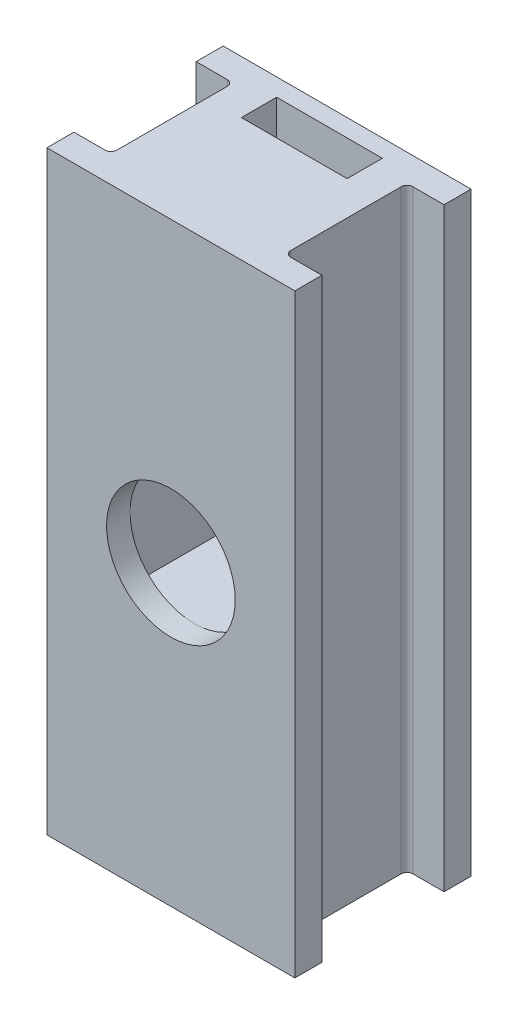
ISO-10303-21;
HEADER;
FILE_DESCRIPTION(('STEP AP214'),'2;1');
FILE_NAME('part.step','',(''),(''),'','','');
FILE_SCHEMA(('AUTOMOTIVE_DESIGN { 1 0 10303 214 1 1 1 1 }'));
ENDSEC;
DATA;
#1=APPLICATION_CONTEXT('core data for automotive mechanical design processes');
#2=APPLICATION_PROTOCOL_DEFINITION('international standard','automotive_design',2000,#1);
#3=PRODUCT_CONTEXT('',#1,'mechanical');
#4=PRODUCT('Part','Part','',(#3));
#5=PRODUCT_RELATED_PRODUCT_CATEGORY('part','',(#4));
#6=PRODUCT_DEFINITION_FORMATION('','',#4);
#7=PRODUCT_DEFINITION_CONTEXT('part definition',#1,'design');
#8=PRODUCT_DEFINITION('design','',#6,#7);
#9=PRODUCT_DEFINITION_SHAPE('','',#8);
#10=(LENGTH_UNIT() NAMED_UNIT(*) SI_UNIT(.MILLI.,.METRE.));
#11=(NAMED_UNIT(*) PLANE_ANGLE_UNIT() SI_UNIT($,.RADIAN.));
#12=(NAMED_UNIT(*) SI_UNIT($,.STERADIAN.) SOLID_ANGLE_UNIT());
#13=UNCERTAINTY_MEASURE_WITH_UNIT(LENGTH_MEASURE(1.E-05),#10,'distance_accuracy_value','');
#14=(GEOMETRIC_REPRESENTATION_CONTEXT(3) GLOBAL_UNCERTAINTY_ASSIGNED_CONTEXT((#13)) GLOBAL_UNIT_ASSIGNED_CONTEXT((#10,
#11,#12)) REPRESENTATION_CONTEXT('',''));
#15=CARTESIAN_POINT('',(0.,0.,0.));
#16=DIRECTION('',(0.,0.,1.));
#17=DIRECTION('',(1.,0.,0.));
#18=AXIS2_PLACEMENT_3D('',#15,#16,#17);
#19=CARTESIAN_POINT('',(10.5500000000305,-18.524999999939,7.5));
#20=DIRECTION('',(0.,1.,0.));
#21=DIRECTION('',(0.,0.,1.));
#22=AXIS2_PLACEMENT_3D('',#19,#20,#21);
#23=PLANE('',#22);
#24=DIRECTION('',(1.,0.,0.));
#25=VECTOR('',#24,1.);
#26=CARTESIAN_POINT('',(10.5500000000305,-18.524999999939,-7.5));
#27=LINE('',#26,#25);
#28=CARTESIAN_POINT('',(-10.5499999999696,-18.524999999939,-7.5));
#29=VERTEX_POINT('',#28);
#30=CARTESIAN_POINT('',(-5.55000000000001,-18.524999999939,-7.5));
#31=VERTEX_POINT('',#30);
#32=EDGE_CURVE('E386',#29,#31,#27,.T.);
#33=ORIENTED_EDGE('',*,*,#32,.T.);
#34=DIRECTION('',(0.,0.,1.));
#35=VECTOR('',#34,1.);
#36=CARTESIAN_POINT('',(-5.55000000000001,-18.524999999939,7.5));
#37=LINE('',#36,#35);
#38=CARTESIAN_POINT('',(-5.55000000000001,-18.524999999939,5.5));
#39=VERTEX_POINT('',#38);
#40=EDGE_CURVE('E308',#31,#39,#37,.T.);
#41=ORIENTED_EDGE('',*,*,#40,.T.);
#42=DIRECTION('',(1.,0.,0.));
#43=VECTOR('',#42,1.);
#44=CARTESIAN_POINT('',(10.5500000000305,-18.524999999939,5.5));
#45=LINE('',#44,#43);
#46=CARTESIAN_POINT('',(5.55,-18.524999999939,5.5));
#47=VERTEX_POINT('',#46);
#48=EDGE_CURVE('E11',#39,#47,#45,.T.);
#49=ORIENTED_EDGE('',*,*,#48,.T.);
#50=DIRECTION('',(0.,0.,-1.));
#51=VECTOR('',#50,1.);
#52=CARTESIAN_POINT('',(5.55,-18.524999999939,7.5));
#53=LINE('',#52,#51);
#54=CARTESIAN_POINT('',(5.55,-18.524999999939,-7.5));
#55=VERTEX_POINT('',#54);
#56=EDGE_CURVE('E295',#47,#55,#53,.T.);
#57=ORIENTED_EDGE('',*,*,#56,.T.);
#58=CARTESIAN_POINT('',(10.5500000000305,-18.524999999939,-7.5));
#59=VERTEX_POINT('',#58);
#60=EDGE_CURVE('E374',#55,#59,#27,.T.);
#61=ORIENTED_EDGE('',*,*,#60,.T.);
#62=DIRECTION('',(0.,0.,-1.));
#63=VECTOR('',#62,1.);
#64=CARTESIAN_POINT('',(10.5500000000305,-18.524999999939,7.5));
#65=LINE('',#64,#63);
#66=CARTESIAN_POINT('',(10.5499999999696,-18.524999999939,-5.2));
#67=VERTEX_POINT('',#66);
#68=EDGE_CURVE('E408',#67,#59,#65,.T.);
#69=ORIENTED_EDGE('',*,*,#68,.F.);
#70=DIRECTION('',(1.,0.,0.));
#71=VECTOR('',#70,1.);
#72=CARTESIAN_POINT('',(10.5499999999696,-18.524999999939,-5.2));
#73=LINE('',#72,#71);
#74=CARTESIAN_POINT('',(7.89999999995317,-18.524999999939,-5.2));
#75=VERTEX_POINT('',#74);
#76=EDGE_CURVE('E333',#75,#67,#73,.T.);
#77=ORIENTED_EDGE('',*,*,#76,.F.);
#78=CARTESIAN_POINT('',(7.89999999995317,-18.524999999939,-4.7));
#79=DIRECTION('',(0.,1.,0.));
#80=DIRECTION('',(0.,0.,1.));
#81=AXIS2_PLACEMENT_3D('',#78,#79,#80);
#82=CIRCLE('',#81,0.5);
#83=CARTESIAN_POINT('',(7.39999999995317,-18.524999999939,-4.7));
#84=VERTEX_POINT('',#83);
#85=EDGE_CURVE('E453',#75,#84,#82,.T.);
#86=ORIENTED_EDGE('',*,*,#85,.T.);
#87=DIRECTION('',(0.,0.,-1.));
#88=VECTOR('',#87,1.);
#89=CARTESIAN_POINT('',(7.39999999995317,-18.524999999939,-5.2));
#90=LINE('',#89,#88);
#91=CARTESIAN_POINT('',(7.39999999995317,-18.524999999939,4.7));
#92=VERTEX_POINT('',#91);
#93=EDGE_CURVE('E341',#92,#84,#90,.T.);
#94=ORIENTED_EDGE('',*,*,#93,.F.);
#95=CARTESIAN_POINT('',(7.89999999995317,-18.524999999939,4.7));
#96=DIRECTION('',(0.,1.,0.));
#97=DIRECTION('',(0.,0.,1.));
#98=AXIS2_PLACEMENT_3D('',#95,#96,#97);
#99=CIRCLE('',#98,0.5);
#100=CARTESIAN_POINT('',(7.89999999995317,-18.524999999939,5.2));
#101=VERTEX_POINT('',#100);
#102=EDGE_CURVE('E457',#92,#101,#99,.T.);
#103=ORIENTED_EDGE('',*,*,#102,.T.);
#104=DIRECTION('',(-1.,0.,0.));
#105=VECTOR('',#104,1.);
#106=CARTESIAN_POINT('',(10.5499999999696,-18.524999999939,5.2));
#107=LINE('',#106,#105);
#108=CARTESIAN_POINT('',(10.5499999999696,-18.524999999939,5.2));
#109=VERTEX_POINT('',#108);
#110=EDGE_CURVE('E344',#109,#101,#107,.T.);
#111=ORIENTED_EDGE('',*,*,#110,.F.);
#112=CARTESIAN_POINT('',(10.5500000000305,-18.524999999939,7.5));
#113=VERTEX_POINT('',#112);
#114=EDGE_CURVE('E409',#113,#109,#65,.T.);
#115=ORIENTED_EDGE('',*,*,#114,.F.);
#116=DIRECTION('',(1.,0.,0.));
#117=VECTOR('',#116,1.);
#118=CARTESIAN_POINT('',(10.5500000000305,-18.524999999939,7.5));
#119=LINE('',#118,#117);
#120=CARTESIAN_POINT('',(-10.5499999999696,-18.524999999939,7.5));
#121=VERTEX_POINT('',#120);
#122=EDGE_CURVE('E375',#121,#113,#119,.T.);
#123=ORIENTED_EDGE('',*,*,#122,.F.);
#124=DIRECTION('',(0.,0.,-1.));
#125=VECTOR('',#124,1.);
#126=CARTESIAN_POINT('',(-10.5499999999696,-18.524999999939,7.5));
#127=LINE('',#126,#125);
#128=CARTESIAN_POINT('',(-10.5499999999696,-18.524999999939,5.2));
#129=VERTEX_POINT('',#128);
#130=EDGE_CURVE('E397',#121,#129,#127,.T.);
#131=ORIENTED_EDGE('',*,*,#130,.T.);
#132=DIRECTION('',(1.,0.,0.));
#133=VECTOR('',#132,1.);
#134=CARTESIAN_POINT('',(-10.5499999999696,-18.524999999939,5.2));
#135=LINE('',#134,#133);
#136=CARTESIAN_POINT('',(-7.89999999995317,-18.524999999939,5.2));
#137=VERTEX_POINT('',#136);
#138=EDGE_CURVE('E351',#129,#137,#135,.T.);
#139=ORIENTED_EDGE('',*,*,#138,.T.);
#140=CARTESIAN_POINT('',(-7.89999999995317,-18.524999999939,4.7));
#141=DIRECTION('',(0.,1.,0.));
#142=DIRECTION('',(0.,0.,1.));
#143=AXIS2_PLACEMENT_3D('',#140,#141,#142);
#144=CIRCLE('',#143,0.5);
#145=CARTESIAN_POINT('',(-7.39999999995317,-18.524999999939,4.7));
#146=VERTEX_POINT('',#145);
#147=EDGE_CURVE('E449',#137,#146,#144,.T.);
#148=ORIENTED_EDGE('',*,*,#147,.T.);
#149=DIRECTION('',(0.,0.,-1.));
#150=VECTOR('',#149,1.);
#151=CARTESIAN_POINT('',(-7.39999999995317,-18.524999999939,-5.2));
#152=LINE('',#151,#150);
#153=CARTESIAN_POINT('',(-7.39999999995317,-18.524999999939,-4.7));
#154=VERTEX_POINT('',#153);
#155=EDGE_CURVE('E355',#146,#154,#152,.T.);
#156=ORIENTED_EDGE('',*,*,#155,.T.);
#157=CARTESIAN_POINT('',(-7.89999999995317,-18.524999999939,-4.7));
#158=DIRECTION('',(0.,1.,0.));
#159=DIRECTION('',(0.,0.,1.));
#160=AXIS2_PLACEMENT_3D('',#157,#158,#159);
#161=CIRCLE('',#160,0.5);
#162=CARTESIAN_POINT('',(-7.89999999995317,-18.524999999939,-5.2));
#163=VERTEX_POINT('',#162);
#164=EDGE_CURVE('E445',#154,#163,#161,.T.);
#165=ORIENTED_EDGE('',*,*,#164,.T.);
#166=DIRECTION('',(-1.,0.,0.));
#167=VECTOR('',#166,1.);
#168=CARTESIAN_POINT('',(-10.5499999999696,-18.524999999939,-5.2));
#169=LINE('',#168,#167);
#170=CARTESIAN_POINT('',(-10.5499999999696,-18.524999999939,-5.2));
#171=VERTEX_POINT('',#170);
#172=EDGE_CURVE('E358',#163,#171,#169,.T.);
#173=ORIENTED_EDGE('',*,*,#172,.T.);
#174=EDGE_CURVE('E385',#171,#29,#127,.T.);
#175=ORIENTED_EDGE('',*,*,#174,.T.);
#176=EDGE_LOOP('',(#33,#41,#49,#57,#61,#69,#77,#86,#94,#103,#111,#115,#123,#131,#139,#148,#156,
#165,#173,#175));
#177=FACE_BOUND('',#176,.T.);
#178=ADVANCED_FACE('F37',(#177),#23,.F.);
#179=CARTESIAN_POINT('',(10.5500000000305,-18.524999999939,7.5));
#180=DIRECTION('',(-1.,0.,0.));
#181=DIRECTION('',(0.,0.,1.));
#182=AXIS2_PLACEMENT_3D('',#179,#180,#181);
#183=PLANE('',#182);
#184=DIRECTION('',(0.,1.,0.));
#185=VECTOR('',#184,1.);
#186=CARTESIAN_POINT('',(10.5499999999696,-18.524999999939,5.2));
#187=LINE('',#186,#185);
#188=CARTESIAN_POINT('',(10.5499999999696,32.124999999939,5.2));
#189=VERTEX_POINT('',#188);
#190=EDGE_CURVE('E348',#109,#189,#187,.T.);
#191=ORIENTED_EDGE('',*,*,#190,.T.);
#192=DIRECTION('',(0.,0.,-1.));
#193=VECTOR('',#192,1.);
#194=CARTESIAN_POINT('',(10.5500000000305,32.124999999939,7.5));
#195=LINE('',#194,#193);
#196=CARTESIAN_POINT('',(10.5500000000305,32.124999999939,7.5));
#197=VERTEX_POINT('',#196);
#198=EDGE_CURVE('E405',#197,#189,#195,.T.);
#199=ORIENTED_EDGE('',*,*,#198,.F.);
#200=DIRECTION('',(0.,1.,0.));
#201=VECTOR('',#200,1.);
#202=CARTESIAN_POINT('',(10.5500000000305,-18.524999999939,7.5));
#203=LINE('',#202,#201);
#204=EDGE_CURVE('E378',#113,#197,#203,.T.);
#205=ORIENTED_EDGE('',*,*,#204,.F.);
#206=ORIENTED_EDGE('',*,*,#114,.T.);
#207=EDGE_LOOP('',(#191,#199,#205,#206));
#208=FACE_BOUND('',#207,.T.);
#209=ADVANCED_FACE('F498',(#208),#183,.F.);
#210=DIRECTION('',(0.,1.,0.));
#211=VECTOR('',#210,1.);
#212=CARTESIAN_POINT('',(10.5499999999696,-18.524999999939,-5.2));
#213=LINE('',#212,#211);
#214=CARTESIAN_POINT('',(10.5500000000305,32.124999999939,-5.2));
#215=VERTEX_POINT('',#214);
#216=EDGE_CURVE('E347',#67,#215,#213,.T.);
#217=ORIENTED_EDGE('',*,*,#216,.F.);
#218=ORIENTED_EDGE('',*,*,#68,.T.);
#219=DIRECTION('',(0.,1.,0.));
#220=VECTOR('',#219,1.);
#221=CARTESIAN_POINT('',(10.5500000000305,-18.524999999939,-7.5));
#222=LINE('',#221,#220);
#223=CARTESIAN_POINT('',(10.5500000000305,32.124999999939,-7.5));
#224=VERTEX_POINT('',#223);
#225=EDGE_CURVE('E389',#59,#224,#222,.T.);
#226=ORIENTED_EDGE('',*,*,#225,.T.);
#227=EDGE_CURVE('E404',#215,#224,#195,.T.);
#228=ORIENTED_EDGE('',*,*,#227,.F.);
#229=EDGE_LOOP('',(#217,#218,#226,#228));
#230=FACE_BOUND('',#229,.T.);
#231=ADVANCED_FACE('F503',(#230),#183,.F.);
#232=CARTESIAN_POINT('',(10.5500000000305,32.124999999939,7.5));
#233=DIRECTION('',(0.,-1.,0.));
#234=DIRECTION('',(0.,0.,-1.));
#235=AXIS2_PLACEMENT_3D('',#232,#233,#234);
#236=PLANE('',#235);
#237=DIRECTION('',(1.,0.,0.));
#238=VECTOR('',#237,1.);
#239=CARTESIAN_POINT('',(-4.5,32.124999999939,-3.));
#240=LINE('',#239,#238);
#241=CARTESIAN_POINT('',(-4.5,32.124999999939,-3.));
#242=VERTEX_POINT('',#241);
#243=CARTESIAN_POINT('',(4.5,32.124999999939,-3.));
#244=VERTEX_POINT('',#243);
#245=EDGE_CURVE('E249',#242,#244,#240,.T.);
#246=ORIENTED_EDGE('',*,*,#245,.F.);
#247=DIRECTION('',(0.,0.,1.));
#248=VECTOR('',#247,1.);
#249=CARTESIAN_POINT('',(-4.5,32.124999999939,-6.));
#250=LINE('',#249,#248);
#251=CARTESIAN_POINT('',(-4.5,32.124999999939,-6.));
#252=VERTEX_POINT('',#251);
#253=EDGE_CURVE('E52',#252,#242,#250,.T.);
#254=ORIENTED_EDGE('',*,*,#253,.F.);
#255=DIRECTION('',(-1.,0.,0.));
#256=VECTOR('',#255,1.);
#257=CARTESIAN_POINT('',(-4.5,32.124999999939,-6.));
#258=LINE('',#257,#256);
#259=CARTESIAN_POINT('',(4.5,32.124999999939,-6.));
#260=VERTEX_POINT('',#259);
#261=EDGE_CURVE('E256',#260,#252,#258,.T.);
#262=ORIENTED_EDGE('',*,*,#261,.F.);
#263=DIRECTION('',(0.,0.,-1.));
#264=VECTOR('',#263,1.);
#265=CARTESIAN_POINT('',(4.5,32.124999999939,-6.));
#266=LINE('',#265,#264);
#267=EDGE_CURVE('E240',#244,#260,#266,.T.);
#268=ORIENTED_EDGE('',*,*,#267,.F.);
#269=EDGE_LOOP('',(#246,#254,#262,#268));
#270=FACE_BOUND('',#269,.T.);
#271=DIRECTION('',(1.,0.,0.));
#272=VECTOR('',#271,1.);
#273=CARTESIAN_POINT('',(10.5500000000305,32.124999999939,5.2));
#274=LINE('',#273,#272);
#275=CARTESIAN_POINT('',(7.89999999995317,32.124999999939,5.2));
#276=VERTEX_POINT('',#275);
#277=EDGE_CURVE('E421',#276,#189,#274,.T.);
#278=ORIENTED_EDGE('',*,*,#277,.F.);
#279=CARTESIAN_POINT('',(7.89999999995317,32.124999999939,4.7));
#280=DIRECTION('',(0.,-1.,0.));
#281=DIRECTION('',(0.,0.,-1.));
#282=AXIS2_PLACEMENT_3D('',#279,#280,#281);
#283=CIRCLE('',#282,0.5);
#284=CARTESIAN_POINT('',(7.39999999995317,32.124999999939,4.7));
#285=VERTEX_POINT('',#284);
#286=EDGE_CURVE('E455',#276,#285,#283,.T.);
#287=ORIENTED_EDGE('',*,*,#286,.T.);
#288=DIRECTION('',(0.,0.,1.));
#289=VECTOR('',#288,1.);
#290=CARTESIAN_POINT('',(7.39999999995317,32.124999999939,7.5));
#291=LINE('',#290,#289);
#292=CARTESIAN_POINT('',(7.39999999995317,32.124999999939,-4.7));
#293=VERTEX_POINT('',#292);
#294=EDGE_CURVE('E418',#293,#285,#291,.T.);
#295=ORIENTED_EDGE('',*,*,#294,.F.);
#296=CARTESIAN_POINT('',(7.89999999995317,32.124999999939,-4.7));
#297=DIRECTION('',(0.,-1.,0.));
#298=DIRECTION('',(0.,0.,-1.));
#299=AXIS2_PLACEMENT_3D('',#296,#297,#298);
#300=CIRCLE('',#299,0.5);
#301=CARTESIAN_POINT('',(7.89999999995317,32.124999999939,-5.2));
#302=VERTEX_POINT('',#301);
#303=EDGE_CURVE('E451',#293,#302,#300,.T.);
#304=ORIENTED_EDGE('',*,*,#303,.T.);
#305=DIRECTION('',(-1.,0.,0.));
#306=VECTOR('',#305,1.);
#307=CARTESIAN_POINT('',(10.5500000000305,32.124999999939,-5.2));
#308=LINE('',#307,#306);
#309=EDGE_CURVE('E415',#215,#302,#308,.T.);
#310=ORIENTED_EDGE('',*,*,#309,.F.);
#311=ORIENTED_EDGE('',*,*,#227,.T.);
#312=DIRECTION('',(-1.,0.,0.));
#313=VECTOR('',#312,1.);
#314=CARTESIAN_POINT('',(10.5500000000305,32.124999999939,-7.5));
#315=LINE('',#314,#313);
#316=CARTESIAN_POINT('',(-10.5499999999696,32.124999999939,-7.5));
#317=VERTEX_POINT('',#316);
#318=EDGE_CURVE('E392',#224,#317,#315,.T.);
#319=ORIENTED_EDGE('',*,*,#318,.T.);
#320=DIRECTION('',(0.,0.,-1.));
#321=VECTOR('',#320,1.);
#322=CARTESIAN_POINT('',(-10.5499999999696,32.124999999939,7.5));
#323=LINE('',#322,#321);
#324=CARTESIAN_POINT('',(-10.5499999999696,32.124999999939,-5.2));
#325=VERTEX_POINT('',#324);
#326=EDGE_CURVE('E400',#325,#317,#323,.T.);
#327=ORIENTED_EDGE('',*,*,#326,.F.);
#328=DIRECTION('',(1.,0.,0.));
#329=VECTOR('',#328,1.);
#330=CARTESIAN_POINT('',(10.5500000000305,32.124999999939,-5.2));
#331=LINE('',#330,#329);
#332=CARTESIAN_POINT('',(-7.89999999995317,32.124999999939,-5.2));
#333=VERTEX_POINT('',#332);
#334=EDGE_CURVE('E368',#325,#333,#331,.T.);
#335=ORIENTED_EDGE('',*,*,#334,.T.);
#336=CARTESIAN_POINT('',(-7.89999999995317,32.124999999939,-4.7));
#337=DIRECTION('',(0.,-1.,0.));
#338=DIRECTION('',(0.,0.,-1.));
#339=AXIS2_PLACEMENT_3D('',#336,#337,#338);
#340=CIRCLE('',#339,0.5);
#341=CARTESIAN_POINT('',(-7.39999999995317,32.124999999939,-4.7));
#342=VERTEX_POINT('',#341);
#343=EDGE_CURVE('E443',#333,#342,#340,.T.);
#344=ORIENTED_EDGE('',*,*,#343,.T.);
#345=DIRECTION('',(0.,0.,1.));
#346=VECTOR('',#345,1.);
#347=CARTESIAN_POINT('',(-7.39999999995317,32.124999999939,7.5));
#348=LINE('',#347,#346);
#349=CARTESIAN_POINT('',(-7.39999999995317,32.124999999939,4.7));
#350=VERTEX_POINT('',#349);
#351=EDGE_CURVE('E412',#342,#350,#348,.T.);
#352=ORIENTED_EDGE('',*,*,#351,.T.);
#353=CARTESIAN_POINT('',(-7.89999999995317,32.124999999939,4.7));
#354=DIRECTION('',(0.,-1.,0.));
#355=DIRECTION('',(0.,0.,-1.));
#356=AXIS2_PLACEMENT_3D('',#353,#354,#355);
#357=CIRCLE('',#356,0.5);
#358=CARTESIAN_POINT('',(-7.89999999995317,32.124999999939,5.2));
#359=VERTEX_POINT('',#358);
#360=EDGE_CURVE('E447',#350,#359,#357,.T.);
#361=ORIENTED_EDGE('',*,*,#360,.T.);
#362=DIRECTION('',(-1.,0.,0.));
#363=VECTOR('',#362,1.);
#364=CARTESIAN_POINT('',(10.5500000000305,32.124999999939,5.2));
#365=LINE('',#364,#363);
#366=CARTESIAN_POINT('',(-10.5499999999696,32.124999999939,5.2));
#367=VERTEX_POINT('',#366);
#368=EDGE_CURVE('E364',#359,#367,#365,.T.);
#369=ORIENTED_EDGE('',*,*,#368,.T.);
#370=CARTESIAN_POINT('',(-10.5499999999696,32.124999999939,7.5));
#371=VERTEX_POINT('',#370);
#372=EDGE_CURVE('E401',#371,#367,#323,.T.);
#373=ORIENTED_EDGE('',*,*,#372,.F.);
#374=DIRECTION('',(-1.,0.,0.));
#375=VECTOR('',#374,1.);
#376=CARTESIAN_POINT('',(10.5500000000305,32.124999999939,7.5));
#377=LINE('',#376,#375);
#378=EDGE_CURVE('E381',#197,#371,#377,.T.);
#379=ORIENTED_EDGE('',*,*,#378,.F.);
#380=ORIENTED_EDGE('',*,*,#198,.T.);
#381=EDGE_LOOP('',(#278,#287,#295,#304,#310,#311,#319,#327,#335,#344,#352,#361,#369,#373,#379,#380));
#382=FACE_BOUND('',#381,.T.);
#383=ADVANCED_FACE('F253',(#270,#382),#236,.F.);
#384=CARTESIAN_POINT('',(-10.5499999999696,-18.524999999939,7.5));
#385=DIRECTION('',(1.,0.,0.));
#386=DIRECTION('',(0.,0.,-1.));
#387=AXIS2_PLACEMENT_3D('',#384,#385,#386);
#388=PLANE('',#387);
#389=ORIENTED_EDGE('',*,*,#174,.F.);
#390=DIRECTION('',(0.,1.,0.));
#391=VECTOR('',#390,1.);
#392=CARTESIAN_POINT('',(-10.5499999999696,-18.524999999939,-5.2));
#393=LINE('',#392,#391);
#394=EDGE_CURVE('E361',#171,#325,#393,.T.);
#395=ORIENTED_EDGE('',*,*,#394,.T.);
#396=ORIENTED_EDGE('',*,*,#326,.T.);
#397=DIRECTION('',(0.,-1.,0.));
#398=VECTOR('',#397,1.);
#399=CARTESIAN_POINT('',(-10.5499999999696,-18.524999999939,-7.5));
#400=LINE('',#399,#398);
#401=EDGE_CURVE('E379',#317,#29,#400,.T.);
#402=ORIENTED_EDGE('',*,*,#401,.T.);
#403=EDGE_LOOP('',(#389,#395,#396,#402));
#404=FACE_BOUND('',#403,.T.);
#405=ADVANCED_FACE('F572',(#404),#388,.F.);
#406=CARTESIAN_POINT('',(0.,0.,7.5));
#407=DIRECTION('',(0.,0.,-1.));
#408=DIRECTION('',(-1.,0.,0.));
#409=AXIS2_PLACEMENT_3D('',#406,#407,#408);
#410=PLANE('',#409);
#411=ORIENTED_EDGE('',*,*,#122,.T.);
#412=ORIENTED_EDGE('',*,*,#204,.T.);
#413=ORIENTED_EDGE('',*,*,#378,.T.);
#414=DIRECTION('',(0.,-1.,0.));
#415=VECTOR('',#414,1.);
#416=CARTESIAN_POINT('',(-10.5499999999696,-18.524999999939,7.5));
#417=LINE('',#416,#415);
#418=EDGE_CURVE('E383',#371,#121,#417,.T.);
#419=ORIENTED_EDGE('',*,*,#418,.T.);
#420=EDGE_LOOP('',(#411,#412,#413,#419));
#421=FACE_BOUND('',#420,.T.);
#422=CARTESIAN_POINT('',(0.,6.80000000000001,7.5));
#423=DIRECTION('',(0.,0.,1.));
#424=DIRECTION('',(1.,0.,0.));
#425=AXIS2_PLACEMENT_3D('',#422,#423,#424);
#426=CIRCLE('',#425,5.47500000006105);
#427=CARTESIAN_POINT('',(5.47500000006105,6.80000000000001,7.5));
#428=VERTEX_POINT('',#427);
#429=EDGE_CURVE('E371',#428,#428,#426,.T.);
#430=ORIENTED_EDGE('',*,*,#429,.F.);
#431=EDGE_LOOP('',(#430));
#432=FACE_BOUND('',#431,.T.);
#433=ADVANCED_FACE('F545',(#421,#432),#410,.F.);
#434=CARTESIAN_POINT('',(0.,0.,-7.5));
#435=DIRECTION('',(0.,0.,-1.));
#436=DIRECTION('',(-1.,0.,0.));
#437=AXIS2_PLACEMENT_3D('',#434,#435,#436);
#438=PLANE('',#437);
#439=DIRECTION('',(0.,1.,0.));
#440=VECTOR('',#439,1.);
#441=CARTESIAN_POINT('',(-5.55,0.,-7.5));
#442=LINE('',#441,#440);
#443=CARTESIAN_POINT('',(-5.55,-1.17500000006105,-7.5));
#444=VERTEX_POINT('',#443);
#445=EDGE_CURVE('E45',#31,#444,#442,.T.);
#446=ORIENTED_EDGE('',*,*,#445,.F.);
#447=ORIENTED_EDGE('',*,*,#32,.F.);
#448=ORIENTED_EDGE('',*,*,#401,.F.);
#449=ORIENTED_EDGE('',*,*,#318,.F.);
#450=ORIENTED_EDGE('',*,*,#225,.F.);
#451=ORIENTED_EDGE('',*,*,#60,.F.);
#452=DIRECTION('',(0.,-1.,0.));
#453=VECTOR('',#452,1.);
#454=CARTESIAN_POINT('',(5.55,-1.17500000006105,-7.5));
#455=LINE('',#454,#453);
#456=CARTESIAN_POINT('',(5.55,-1.17500000006105,-7.5));
#457=VERTEX_POINT('',#456);
#458=EDGE_CURVE('E286',#457,#55,#455,.T.);
#459=ORIENTED_EDGE('',*,*,#458,.F.);
#460=DIRECTION('',(1.,0.,0.));
#461=VECTOR('',#460,1.);
#462=CARTESIAN_POINT('',(5.55,-1.17500000006105,-7.5));
#463=LINE('',#462,#461);
#464=EDGE_CURVE('E288',#444,#457,#463,.T.);
#465=ORIENTED_EDGE('',*,*,#464,.F.);
#466=EDGE_LOOP('',(#446,#447,#448,#449,#450,#451,#459,#465));
#467=FACE_BOUND('',#466,.T.);
#468=DIRECTION('',(-1.,0.,0.));
#469=VECTOR('',#468,1.);
#470=CARTESIAN_POINT('',(-5.55,1.32499999993896,-7.5));
#471=LINE('',#470,#469);
#472=CARTESIAN_POINT('',(5.55,1.32499999993895,-7.5));
#473=VERTEX_POINT('',#472);
#474=CARTESIAN_POINT('',(-5.55,1.32499999993896,-7.5));
#475=VERTEX_POINT('',#474);
#476=EDGE_CURVE('E311',#473,#475,#471,.T.);
#477=ORIENTED_EDGE('',*,*,#476,.F.);
#478=DIRECTION('',(0.,-1.,0.));
#479=VECTOR('',#478,1.);
#480=CARTESIAN_POINT('',(5.55,1.32499999993895,-7.5));
#481=LINE('',#480,#479);
#482=CARTESIAN_POINT('',(5.55,22.324999999939,-7.5));
#483=VERTEX_POINT('',#482);
#484=EDGE_CURVE('E328',#483,#473,#481,.T.);
#485=ORIENTED_EDGE('',*,*,#484,.F.);
#486=DIRECTION('',(1.,0.,0.));
#487=VECTOR('',#486,1.);
#488=CARTESIAN_POINT('',(5.55,22.324999999939,-7.5));
#489=LINE('',#488,#487);
#490=CARTESIAN_POINT('',(-5.55,22.324999999939,-7.5));
#491=VERTEX_POINT('',#490);
#492=EDGE_CURVE('E325',#491,#483,#489,.T.);
#493=ORIENTED_EDGE('',*,*,#492,.F.);
#494=DIRECTION('',(0.,1.,0.));
#495=VECTOR('',#494,1.);
#496=CARTESIAN_POINT('',(-5.55,22.324999999939,-7.5));
#497=LINE('',#496,#495);
#498=EDGE_CURVE('E322',#475,#491,#497,.T.);
#499=ORIENTED_EDGE('',*,*,#498,.F.);
#500=EDGE_LOOP('',(#477,#485,#493,#499));
#501=FACE_BOUND('',#500,.T.);
#502=ADVANCED_FACE('F474',(#467,#501),#438,.T.);
#503=ORIENTED_EDGE('',*,*,#372,.T.);
#504=DIRECTION('',(0.,1.,0.));
#505=VECTOR('',#504,1.);
#506=CARTESIAN_POINT('',(-10.5499999999696,-18.524999999939,5.2));
#507=LINE('',#506,#505);
#508=EDGE_CURVE('E360',#129,#367,#507,.T.);
#509=ORIENTED_EDGE('',*,*,#508,.F.);
#510=ORIENTED_EDGE('',*,*,#130,.F.);
#511=ORIENTED_EDGE('',*,*,#418,.F.);
#512=EDGE_LOOP('',(#503,#509,#510,#511));
#513=FACE_BOUND('',#512,.T.);
#514=ADVANCED_FACE('F552',(#513),#388,.F.);
#515=CARTESIAN_POINT('',(0.,6.80000000000001,7.5));
#516=DIRECTION('',(0.,0.,-1.));
#517=DIRECTION('',(-1.,0.,0.));
#518=AXIS2_PLACEMENT_3D('',#515,#516,#517);
#519=CYLINDRICAL_SURFACE('',#518,5.47500000006105);
#520=CARTESIAN_POINT('',(0.,6.80000000000001,5.5));
#521=DIRECTION('',(0.,0.,1.));
#522=DIRECTION('',(1.,0.,0.));
#523=AXIS2_PLACEMENT_3D('',#520,#521,#522);
#524=CIRCLE('',#523,5.47500000006105);
#525=CARTESIAN_POINT('',(0.,1.32499999993896,5.5));
#526=VERTEX_POINT('',#525);
#527=EDGE_CURVE('E459',#526,#526,#524,.T.);
#528=ORIENTED_EDGE('',*,*,#527,.F.);
#529=EDGE_LOOP('',(#528));
#530=FACE_BOUND('',#529,.T.);
#531=ORIENTED_EDGE('',*,*,#429,.T.);
#532=EDGE_LOOP('',(#531));
#533=FACE_BOUND('',#532,.T.);
#534=ADVANCED_FACE('F592',(#530,#533),#519,.F.);
#535=CARTESIAN_POINT('',(-7.39999999995317,-18.524999999939,-5.2));
#536=DIRECTION('',(1.,0.,0.));
#537=DIRECTION('',(0.,0.,-1.));
#538=AXIS2_PLACEMENT_3D('',#535,#536,#537);
#539=PLANE('',#538);
#540=ORIENTED_EDGE('',*,*,#351,.F.);
#541=DIRECTION('',(0.,1.,0.));
#542=VECTOR('',#541,1.);
#543=CARTESIAN_POINT('',(-7.39999999995317,-18.524999999939,-4.7));
#544=LINE('',#543,#542);
#545=EDGE_CURVE('E429',#342,#154,#544,.F.);
#546=ORIENTED_EDGE('',*,*,#545,.T.);
#547=ORIENTED_EDGE('',*,*,#155,.F.);
#548=DIRECTION('',(0.,1.,0.));
#549=VECTOR('',#548,1.);
#550=CARTESIAN_POINT('',(-7.39999999995317,32.124999999939,4.7));
#551=LINE('',#550,#549);
#552=EDGE_CURVE('E426',#146,#350,#551,.T.);
#553=ORIENTED_EDGE('',*,*,#552,.T.);
#554=EDGE_LOOP('',(#540,#546,#547,#553));
#555=FACE_BOUND('',#554,.T.);
#556=ADVANCED_FACE('F562',(#555),#539,.F.);
#557=CARTESIAN_POINT('',(-10.5499999999696,-18.524999999939,-5.2));
#558=DIRECTION('',(0.,0.,-1.));
#559=DIRECTION('',(-1.,0.,0.));
#560=AXIS2_PLACEMENT_3D('',#557,#558,#559);
#561=PLANE('',#560);
#562=ORIENTED_EDGE('',*,*,#172,.F.);
#563=DIRECTION('',(0.,1.,0.));
#564=VECTOR('',#563,1.);
#565=CARTESIAN_POINT('',(-7.89999999995317,32.124999999939,-5.2));
#566=LINE('',#565,#564);
#567=EDGE_CURVE('E423',#163,#333,#566,.T.);
#568=ORIENTED_EDGE('',*,*,#567,.T.);
#569=ORIENTED_EDGE('',*,*,#334,.F.);
#570=ORIENTED_EDGE('',*,*,#394,.F.);
#571=EDGE_LOOP('',(#562,#568,#569,#570));
#572=FACE_BOUND('',#571,.T.);
#573=ADVANCED_FACE('F568',(#572),#561,.F.);
#574=CARTESIAN_POINT('',(-10.5499999999696,-18.524999999939,5.2));
#575=DIRECTION('',(0.,0.,1.));
#576=DIRECTION('',(1.,0.,0.));
#577=AXIS2_PLACEMENT_3D('',#574,#575,#576);
#578=PLANE('',#577);
#579=ORIENTED_EDGE('',*,*,#368,.F.);
#580=DIRECTION('',(0.,1.,0.));
#581=VECTOR('',#580,1.);
#582=CARTESIAN_POINT('',(-7.89999999995317,-18.524999999939,5.2));
#583=LINE('',#582,#581);
#584=EDGE_CURVE('E431',#359,#137,#583,.F.);
#585=ORIENTED_EDGE('',*,*,#584,.T.);
#586=ORIENTED_EDGE('',*,*,#138,.F.);
#587=ORIENTED_EDGE('',*,*,#508,.T.);
#588=EDGE_LOOP('',(#579,#585,#586,#587));
#589=FACE_BOUND('',#588,.T.);
#590=ADVANCED_FACE('F555',(#589),#578,.F.);
#591=CARTESIAN_POINT('',(10.5499999999696,-18.524999999939,5.2));
#592=DIRECTION('',(0.,0.,-1.));
#593=DIRECTION('',(-1.,0.,0.));
#594=AXIS2_PLACEMENT_3D('',#591,#592,#593);
#595=PLANE('',#594);
#596=ORIENTED_EDGE('',*,*,#110,.T.);
#597=DIRECTION('',(0.,1.,0.));
#598=VECTOR('',#597,1.);
#599=CARTESIAN_POINT('',(7.89999999995317,32.124999999939,5.2));
#600=LINE('',#599,#598);
#601=EDGE_CURVE('E440',#101,#276,#600,.T.);
#602=ORIENTED_EDGE('',*,*,#601,.T.);
#603=ORIENTED_EDGE('',*,*,#277,.T.);
#604=ORIENTED_EDGE('',*,*,#190,.F.);
#605=EDGE_LOOP('',(#596,#602,#603,#604));
#606=FACE_BOUND('',#605,.T.);
#607=ADVANCED_FACE('F538',(#606),#595,.T.);
#608=CARTESIAN_POINT('',(7.39999999995317,-18.524999999939,-5.2));
#609=DIRECTION('',(1.,0.,0.));
#610=DIRECTION('',(0.,0.,-1.));
#611=AXIS2_PLACEMENT_3D('',#608,#609,#610);
#612=PLANE('',#611);
#613=ORIENTED_EDGE('',*,*,#93,.T.);
#614=DIRECTION('',(0.,1.,0.));
#615=VECTOR('',#614,1.);
#616=CARTESIAN_POINT('',(7.39999999995317,32.124999999939,-4.7));
#617=LINE('',#616,#615);
#618=EDGE_CURVE('E435',#84,#293,#617,.T.);
#619=ORIENTED_EDGE('',*,*,#618,.T.);
#620=ORIENTED_EDGE('',*,*,#294,.T.);
#621=DIRECTION('',(0.,1.,0.));
#622=VECTOR('',#621,1.);
#623=CARTESIAN_POINT('',(7.39999999995317,-18.524999999939,4.7));
#624=LINE('',#623,#622);
#625=EDGE_CURVE('E433',#285,#92,#624,.F.);
#626=ORIENTED_EDGE('',*,*,#625,.T.);
#627=EDGE_LOOP('',(#613,#619,#620,#626));
#628=FACE_BOUND('',#627,.T.);
#629=ADVANCED_FACE('F531',(#628),#612,.T.);
#630=CARTESIAN_POINT('',(10.5499999999696,-18.524999999939,-5.2));
#631=DIRECTION('',(0.,0.,1.));
#632=DIRECTION('',(1.,0.,0.));
#633=AXIS2_PLACEMENT_3D('',#630,#631,#632);
#634=PLANE('',#633);
#635=ORIENTED_EDGE('',*,*,#309,.T.);
#636=DIRECTION('',(0.,1.,0.));
#637=VECTOR('',#636,1.);
#638=CARTESIAN_POINT('',(7.89999999995317,-18.524999999939,-5.2));
#639=LINE('',#638,#637);
#640=EDGE_CURVE('E438',#302,#75,#639,.F.);
#641=ORIENTED_EDGE('',*,*,#640,.T.);
#642=ORIENTED_EDGE('',*,*,#76,.T.);
#643=ORIENTED_EDGE('',*,*,#216,.T.);
#644=EDGE_LOOP('',(#635,#641,#642,#643));
#645=FACE_BOUND('',#644,.T.);
#646=ADVANCED_FACE('F512',(#645),#634,.T.);
#647=CARTESIAN_POINT('',(-7.89999999995317,-18.524999999939,-4.7));
#648=DIRECTION('',(0.,-1.,0.));
#649=DIRECTION('',(0.,0.,-1.));
#650=AXIS2_PLACEMENT_3D('',#647,#648,#649);
#651=CYLINDRICAL_SURFACE('',#650,0.5);
#652=ORIENTED_EDGE('',*,*,#164,.F.);
#653=ORIENTED_EDGE('',*,*,#545,.F.);
#654=ORIENTED_EDGE('',*,*,#343,.F.);
#655=ORIENTED_EDGE('',*,*,#567,.F.);
#656=EDGE_LOOP('',(#652,#653,#654,#655));
#657=FACE_BOUND('',#656,.T.);
#658=ADVANCED_FACE('F508',(#657),#651,.F.);
#659=CARTESIAN_POINT('',(-7.89999999995317,-18.524999999939,4.7));
#660=DIRECTION('',(0.,-1.,0.));
#661=DIRECTION('',(0.,0.,-1.));
#662=AXIS2_PLACEMENT_3D('',#659,#660,#661);
#663=CYLINDRICAL_SURFACE('',#662,0.5);
#664=ORIENTED_EDGE('',*,*,#147,.F.);
#665=ORIENTED_EDGE('',*,*,#584,.F.);
#666=ORIENTED_EDGE('',*,*,#360,.F.);
#667=ORIENTED_EDGE('',*,*,#552,.F.);
#668=EDGE_LOOP('',(#664,#665,#666,#667));
#669=FACE_BOUND('',#668,.T.);
#670=ADVANCED_FACE('F511',(#669),#663,.F.);
#671=CARTESIAN_POINT('',(7.89999999995317,-18.524999999939,-4.7));
#672=DIRECTION('',(0.,-1.,0.));
#673=DIRECTION('',(0.,0.,-1.));
#674=AXIS2_PLACEMENT_3D('',#671,#672,#673);
#675=CYLINDRICAL_SURFACE('',#674,0.5);
#676=ORIENTED_EDGE('',*,*,#85,.F.);
#677=ORIENTED_EDGE('',*,*,#640,.F.);
#678=ORIENTED_EDGE('',*,*,#303,.F.);
#679=ORIENTED_EDGE('',*,*,#618,.F.);
#680=EDGE_LOOP('',(#676,#677,#678,#679));
#681=FACE_BOUND('',#680,.T.);
#682=ADVANCED_FACE('F515',(#681),#675,.F.);
#683=CARTESIAN_POINT('',(7.89999999995317,-18.524999999939,4.7));
#684=DIRECTION('',(0.,-1.,0.));
#685=DIRECTION('',(0.,0.,-1.));
#686=AXIS2_PLACEMENT_3D('',#683,#684,#685);
#687=CYLINDRICAL_SURFACE('',#686,0.5);
#688=ORIENTED_EDGE('',*,*,#102,.F.);
#689=ORIENTED_EDGE('',*,*,#625,.F.);
#690=ORIENTED_EDGE('',*,*,#286,.F.);
#691=ORIENTED_EDGE('',*,*,#601,.F.);
#692=EDGE_LOOP('',(#688,#689,#690,#691));
#693=FACE_BOUND('',#692,.T.);
#694=ADVANCED_FACE('F39',(#693),#687,.F.);
#695=CARTESIAN_POINT('',(-5.55,1.32499999993896,5.5));
#696=DIRECTION('',(0.,-1.,0.));
#697=DIRECTION('',(1.,0.,0.));
#698=AXIS2_PLACEMENT_3D('',#695,#696,#697);
#699=PLANE('',#698);
#700=DIRECTION('',(-1.,0.,0.));
#701=VECTOR('',#700,1.);
#702=CARTESIAN_POINT('',(-5.55,1.32499999993896,5.5));
#703=LINE('',#702,#701);
#704=CARTESIAN_POINT('',(5.55,1.32499999993895,5.5));
#705=VERTEX_POINT('',#704);
#706=EDGE_CURVE('E312',#705,#526,#703,.T.);
#707=ORIENTED_EDGE('',*,*,#706,.F.);
#708=DIRECTION('',(0.,0.,-1.));
#709=VECTOR('',#708,1.);
#710=CARTESIAN_POINT('',(5.55,1.32499999993895,5.5));
#711=LINE('',#710,#709);
#712=EDGE_CURVE('E331',#705,#473,#711,.T.);
#713=ORIENTED_EDGE('',*,*,#712,.T.);
#714=ORIENTED_EDGE('',*,*,#476,.T.);
#715=DIRECTION('',(0.,0.,-1.));
#716=VECTOR('',#715,1.);
#717=CARTESIAN_POINT('',(-5.55,1.32499999993896,5.5));
#718=LINE('',#717,#716);
#719=CARTESIAN_POINT('',(-5.55,1.32499999993896,5.5));
#720=VERTEX_POINT('',#719);
#721=EDGE_CURVE('E320',#720,#475,#718,.T.);
#722=ORIENTED_EDGE('',*,*,#721,.F.);
#723=EDGE_CURVE('E315',#526,#720,#703,.T.);
#724=ORIENTED_EDGE('',*,*,#723,.F.);
#725=EDGE_LOOP('',(#707,#713,#714,#722,#724));
#726=FACE_BOUND('',#725,.T.);
#727=ADVANCED_FACE('F522',(#726),#699,.F.);
#728=CARTESIAN_POINT('',(5.55,1.32499999993895,5.5));
#729=DIRECTION('',(1.,0.,0.));
#730=DIRECTION('',(0.,0.,-1.));
#731=AXIS2_PLACEMENT_3D('',#728,#729,#730);
#732=PLANE('',#731);
#733=ORIENTED_EDGE('',*,*,#484,.T.);
#734=ORIENTED_EDGE('',*,*,#712,.F.);
#735=DIRECTION('',(0.,-1.,0.));
#736=VECTOR('',#735,1.);
#737=CARTESIAN_POINT('',(5.55,1.32499999993895,5.5));
#738=LINE('',#737,#736);
#739=CARTESIAN_POINT('',(5.55,17.324999999939,5.5));
#740=VERTEX_POINT('',#739);
#741=EDGE_CURVE('E318',#740,#705,#738,.T.);
#742=ORIENTED_EDGE('',*,*,#741,.F.);
#743=DIRECTION('',(0.,0.,-1.));
#744=VECTOR('',#743,1.);
#745=CARTESIAN_POINT('',(5.55,17.324999999939,6.5));
#746=LINE('',#745,#744);
#747=CARTESIAN_POINT('',(5.55,17.324999999939,6.5));
#748=VERTEX_POINT('',#747);
#749=EDGE_CURVE('E281',#748,#740,#746,.T.);
#750=ORIENTED_EDGE('',*,*,#749,.F.);
#751=DIRECTION('',(0.,-1.,0.));
#752=VECTOR('',#751,1.);
#753=CARTESIAN_POINT('',(5.55,22.324999999939,6.5));
#754=LINE('',#753,#752);
#755=CARTESIAN_POINT('',(5.55,22.324999999939,6.5));
#756=VERTEX_POINT('',#755);
#757=EDGE_CURVE('E269',#756,#748,#754,.T.);
#758=ORIENTED_EDGE('',*,*,#757,.F.);
#759=DIRECTION('',(0.,0.,-1.));
#760=VECTOR('',#759,1.);
#761=CARTESIAN_POINT('',(5.55,22.324999999939,5.5));
#762=LINE('',#761,#760);
#763=EDGE_CURVE('E334',#756,#483,#762,.T.);
#764=ORIENTED_EDGE('',*,*,#763,.T.);
#765=EDGE_LOOP('',(#733,#734,#742,#750,#758,#764));
#766=FACE_BOUND('',#765,.T.);
#767=ADVANCED_FACE('F700',(#766),#732,.F.);
#768=CARTESIAN_POINT('',(5.55,22.324999999939,5.5));
#769=DIRECTION('',(0.,1.,0.));
#770=DIRECTION('',(-1.,0.,0.));
#771=AXIS2_PLACEMENT_3D('',#768,#769,#770);
#772=PLANE('',#771);
#773=DIRECTION('',(1.,0.,0.));
#774=VECTOR('',#773,1.);
#775=CARTESIAN_POINT('',(-4.5,22.324999999939,-6.));
#776=LINE('',#775,#774);
#777=CARTESIAN_POINT('',(-4.5,22.324999999939,-6.));
#778=VERTEX_POINT('',#777);
#779=CARTESIAN_POINT('',(4.5,22.324999999939,-6.));
#780=VERTEX_POINT('',#779);
#781=EDGE_CURVE('E937',#778,#780,#776,.T.);
#782=ORIENTED_EDGE('',*,*,#781,.F.);
#783=DIRECTION('',(0.,0.,-1.));
#784=VECTOR('',#783,1.);
#785=CARTESIAN_POINT('',(-4.5,22.324999999939,-6.));
#786=LINE('',#785,#784);
#787=CARTESIAN_POINT('',(-4.5,22.324999999939,-3.));
#788=VERTEX_POINT('',#787);
#789=EDGE_CURVE('E268',#788,#778,#786,.T.);
#790=ORIENTED_EDGE('',*,*,#789,.F.);
#791=DIRECTION('',(-1.,0.,0.));
#792=VECTOR('',#791,1.);
#793=CARTESIAN_POINT('',(-4.5,22.324999999939,-3.));
#794=LINE('',#793,#792);
#795=CARTESIAN_POINT('',(4.5,22.324999999939,-3.));
#796=VERTEX_POINT('',#795);
#797=EDGE_CURVE('E265',#796,#788,#794,.T.);
#798=ORIENTED_EDGE('',*,*,#797,.F.);
#799=DIRECTION('',(0.,0.,1.));
#800=VECTOR('',#799,1.);
#801=CARTESIAN_POINT('',(4.5,22.324999999939,-6.));
#802=LINE('',#801,#800);
#803=EDGE_CURVE('E243',#780,#796,#802,.T.);
#804=ORIENTED_EDGE('',*,*,#803,.F.);
#805=EDGE_LOOP('',(#782,#790,#798,#804));
#806=FACE_BOUND('',#805,.T.);
#807=ORIENTED_EDGE('',*,*,#492,.T.);
#808=ORIENTED_EDGE('',*,*,#763,.F.);
#809=DIRECTION('',(1.,0.,0.));
#810=VECTOR('',#809,1.);
#811=CARTESIAN_POINT('',(5.55,22.324999999939,6.5));
#812=LINE('',#811,#810);
#813=CARTESIAN_POINT('',(-5.55,22.324999999939,6.5));
#814=VERTEX_POINT('',#813);
#815=EDGE_CURVE('E278',#814,#756,#812,.T.);
#816=ORIENTED_EDGE('',*,*,#815,.F.);
#817=DIRECTION('',(0.,0.,-1.));
#818=VECTOR('',#817,1.);
#819=CARTESIAN_POINT('',(-5.55,22.324999999939,5.5));
#820=LINE('',#819,#818);
#821=EDGE_CURVE('E336',#814,#491,#820,.T.);
#822=ORIENTED_EDGE('',*,*,#821,.T.);
#823=EDGE_LOOP('',(#807,#808,#816,#822));
#824=FACE_BOUND('',#823,.T.);
#825=ADVANCED_FACE('F814',(#806,#824),#772,.F.);
#826=CARTESIAN_POINT('',(-5.55,22.324999999939,5.5));
#827=DIRECTION('',(-1.,0.,0.));
#828=DIRECTION('',(0.,-1.,0.));
#829=AXIS2_PLACEMENT_3D('',#826,#827,#828);
#830=PLANE('',#829);
#831=ORIENTED_EDGE('',*,*,#498,.T.);
#832=ORIENTED_EDGE('',*,*,#821,.F.);
#833=DIRECTION('',(0.,1.,0.));
#834=VECTOR('',#833,1.);
#835=CARTESIAN_POINT('',(-5.55,22.324999999939,6.5));
#836=LINE('',#835,#834);
#837=CARTESIAN_POINT('',(-5.55,17.324999999939,6.5));
#838=VERTEX_POINT('',#837);
#839=EDGE_CURVE('E275',#838,#814,#836,.T.);
#840=ORIENTED_EDGE('',*,*,#839,.F.);
#841=DIRECTION('',(0.,0.,-1.));
#842=VECTOR('',#841,1.);
#843=CARTESIAN_POINT('',(-5.55,17.324999999939,6.5));
#844=LINE('',#843,#842);
#845=CARTESIAN_POINT('',(-5.55,17.324999999939,5.5));
#846=VERTEX_POINT('',#845);
#847=EDGE_CURVE('E284',#838,#846,#844,.T.);
#848=ORIENTED_EDGE('',*,*,#847,.T.);
#849=DIRECTION('',(0.,1.,0.));
#850=VECTOR('',#849,1.);
#851=CARTESIAN_POINT('',(-5.55,22.324999999939,5.5));
#852=LINE('',#851,#850);
#853=EDGE_CURVE('E314',#720,#846,#852,.T.);
#854=ORIENTED_EDGE('',*,*,#853,.F.);
#855=ORIENTED_EDGE('',*,*,#721,.T.);
#856=EDGE_LOOP('',(#831,#832,#840,#848,#854,#855));
#857=FACE_BOUND('',#856,.T.);
#858=ADVANCED_FACE('F494',(#857),#830,.F.);
#859=CARTESIAN_POINT('',(0.,0.,5.5));
#860=DIRECTION('',(0.,0.,1.));
#861=DIRECTION('',(1.,0.,0.));
#862=AXIS2_PLACEMENT_3D('',#859,#860,#861);
#863=PLANE('',#862);
#864=ORIENTED_EDGE('',*,*,#853,.T.);
#865=DIRECTION('',(-1.,0.,0.));
#866=VECTOR('',#865,1.);
#867=CARTESIAN_POINT('',(5.55,17.324999999939,5.5));
#868=LINE('',#867,#866);
#869=EDGE_CURVE('E267',#740,#846,#868,.T.);
#870=ORIENTED_EDGE('',*,*,#869,.F.);
#871=ORIENTED_EDGE('',*,*,#741,.T.);
#872=ORIENTED_EDGE('',*,*,#706,.T.);
#873=ORIENTED_EDGE('',*,*,#527,.T.);
#874=ORIENTED_EDGE('',*,*,#723,.T.);
#875=EDGE_LOOP('',(#864,#870,#871,#872,#873,#874));
#876=FACE_BOUND('',#875,.T.);
#877=ADVANCED_FACE('F486',(#876),#863,.F.);
#878=CARTESIAN_POINT('',(0.,0.,5.5));
#879=DIRECTION('',(0.,0.,1.));
#880=DIRECTION('',(1.,0.,0.));
#881=AXIS2_PLACEMENT_3D('',#878,#879,#880);
#882=PLANE('',#881);
#883=DIRECTION('',(0.,1.,0.));
#884=VECTOR('',#883,1.);
#885=CARTESIAN_POINT('',(-5.55,-1.17500000006105,5.5));
#886=LINE('',#885,#884);
#887=CARTESIAN_POINT('',(-5.55,-1.17500000006105,5.5));
#888=VERTEX_POINT('',#887);
#889=EDGE_CURVE('E290',#39,#888,#886,.T.);
#890=ORIENTED_EDGE('',*,*,#889,.T.);
#891=DIRECTION('',(1.,0.,0.));
#892=VECTOR('',#891,1.);
#893=CARTESIAN_POINT('',(5.55,-1.17500000006105,5.5));
#894=LINE('',#893,#892);
#895=CARTESIAN_POINT('',(5.55,-1.17500000006105,5.5));
#896=VERTEX_POINT('',#895);
#897=EDGE_CURVE('E297',#888,#896,#894,.T.);
#898=ORIENTED_EDGE('',*,*,#897,.T.);
#899=DIRECTION('',(0.,-1.,0.));
#900=VECTOR('',#899,1.);
#901=CARTESIAN_POINT('',(5.55,-1.17500000006105,5.5));
#902=LINE('',#901,#900);
#903=EDGE_CURVE('E292',#896,#47,#902,.T.);
#904=ORIENTED_EDGE('',*,*,#903,.T.);
#905=ORIENTED_EDGE('',*,*,#48,.F.);
#906=EDGE_LOOP('',(#890,#898,#904,#905));
#907=FACE_BOUND('',#906,.T.);
#908=ADVANCED_FACE('F484',(#907),#882,.F.);
#909=CARTESIAN_POINT('',(-5.55,-1.17500000006105,27.4535662314114));
#910=DIRECTION('',(-1.,0.,0.));
#911=DIRECTION('',(0.,-1.,0.));
#912=AXIS2_PLACEMENT_3D('',#909,#910,#911);
#913=PLANE('',#912);
#914=ORIENTED_EDGE('',*,*,#445,.T.);
#915=DIRECTION('',(0.,0.,-1.));
#916=VECTOR('',#915,1.);
#917=CARTESIAN_POINT('',(-5.55,-1.17500000006105,27.4535662314114));
#918=LINE('',#917,#916);
#919=EDGE_CURVE('E300',#888,#444,#918,.T.);
#920=ORIENTED_EDGE('',*,*,#919,.F.);
#921=ORIENTED_EDGE('',*,*,#889,.F.);
#922=ORIENTED_EDGE('',*,*,#40,.F.);
#923=EDGE_LOOP('',(#914,#920,#921,#922));
#924=FACE_BOUND('',#923,.T.);
#925=ADVANCED_FACE('F464',(#924),#913,.F.);
#926=CARTESIAN_POINT('',(5.55,-1.17500000006105,27.4535662314114));
#927=DIRECTION('',(1.,0.,0.));
#928=DIRECTION('',(0.,1.,0.));
#929=AXIS2_PLACEMENT_3D('',#926,#927,#928);
#930=PLANE('',#929);
#931=ORIENTED_EDGE('',*,*,#903,.F.);
#932=DIRECTION('',(0.,0.,-1.));
#933=VECTOR('',#932,1.);
#934=CARTESIAN_POINT('',(5.55,-1.17500000006105,27.4535662314114));
#935=LINE('',#934,#933);
#936=EDGE_CURVE('E296',#896,#457,#935,.T.);
#937=ORIENTED_EDGE('',*,*,#936,.T.);
#938=ORIENTED_EDGE('',*,*,#458,.T.);
#939=ORIENTED_EDGE('',*,*,#56,.F.);
#940=EDGE_LOOP('',(#931,#937,#938,#939));
#941=FACE_BOUND('',#940,.T.);
#942=ADVANCED_FACE('F479',(#941),#930,.F.);
#943=CARTESIAN_POINT('',(5.55,-1.17500000006105,27.4535662314114));
#944=DIRECTION('',(0.,1.,0.));
#945=DIRECTION('',(0.,0.,1.));
#946=AXIS2_PLACEMENT_3D('',#943,#944,#945);
#947=PLANE('',#946);
#948=ORIENTED_EDGE('',*,*,#919,.T.);
#949=ORIENTED_EDGE('',*,*,#464,.T.);
#950=ORIENTED_EDGE('',*,*,#936,.F.);
#951=ORIENTED_EDGE('',*,*,#897,.F.);
#952=EDGE_LOOP('',(#948,#949,#950,#951));
#953=FACE_BOUND('',#952,.T.);
#954=ADVANCED_FACE('F471',(#953),#947,.F.);
#955=CARTESIAN_POINT('',(5.55,17.324999999939,6.5));
#956=DIRECTION('',(0.,-1.,0.));
#957=DIRECTION('',(0.,0.,-1.));
#958=AXIS2_PLACEMENT_3D('',#955,#956,#957);
#959=PLANE('',#958);
#960=ORIENTED_EDGE('',*,*,#869,.T.);
#961=ORIENTED_EDGE('',*,*,#847,.F.);
#962=DIRECTION('',(-1.,0.,0.));
#963=VECTOR('',#962,1.);
#964=CARTESIAN_POINT('',(5.55,17.324999999939,6.5));
#965=LINE('',#964,#963);
#966=EDGE_CURVE('E272',#748,#838,#965,.T.);
#967=ORIENTED_EDGE('',*,*,#966,.F.);
#968=ORIENTED_EDGE('',*,*,#749,.T.);
#969=EDGE_LOOP('',(#960,#961,#967,#968));
#970=FACE_BOUND('',#969,.T.);
#971=ADVANCED_FACE('F718',(#970),#959,.F.);
#972=CARTESIAN_POINT('',(0.,0.,6.5));
#973=DIRECTION('',(0.,0.,-1.));
#974=DIRECTION('',(-1.,0.,0.));
#975=AXIS2_PLACEMENT_3D('',#972,#973,#974);
#976=PLANE('',#975);
#977=ORIENTED_EDGE('',*,*,#757,.T.);
#978=ORIENTED_EDGE('',*,*,#966,.T.);
#979=ORIENTED_EDGE('',*,*,#839,.T.);
#980=ORIENTED_EDGE('',*,*,#815,.T.);
#981=EDGE_LOOP('',(#977,#978,#979,#980));
#982=FACE_BOUND('',#981,.T.);
#983=ADVANCED_FACE('F722',(#982),#976,.T.);
#984=CARTESIAN_POINT('',(-4.5,12.8381670194339,-6.));
#985=DIRECTION('',(-1.,0.,0.));
#986=DIRECTION('',(0.,0.,1.));
#987=AXIS2_PLACEMENT_3D('',#984,#985,#986);
#988=PLANE('',#987);
#989=ORIENTED_EDGE('',*,*,#789,.T.);
#990=DIRECTION('',(0.,1.,0.));
#991=VECTOR('',#990,1.);
#992=CARTESIAN_POINT('',(-4.5,12.8381670194339,-6.));
#993=LINE('',#992,#991);
#994=EDGE_CURVE('E261',#778,#252,#993,.T.);
#995=ORIENTED_EDGE('',*,*,#994,.T.);
#996=ORIENTED_EDGE('',*,*,#253,.T.);
#997=DIRECTION('',(0.,1.,0.));
#998=VECTOR('',#997,1.);
#999=CARTESIAN_POINT('',(-4.5,12.8381670194339,-3.));
#1000=LINE('',#999,#998);
#1001=EDGE_CURVE('E246',#788,#242,#1000,.T.);
#1002=ORIENTED_EDGE('',*,*,#1001,.F.);
#1003=EDGE_LOOP('',(#989,#995,#996,#1002));
#1004=FACE_BOUND('',#1003,.T.);
#1005=ADVANCED_FACE('F732',(#1004),#988,.F.);
#1006=CARTESIAN_POINT('',(-4.5,12.8381670194339,-6.));
#1007=DIRECTION('',(0.,0.,-1.));
#1008=DIRECTION('',(-1.,0.,0.));
#1009=AXIS2_PLACEMENT_3D('',#1006,#1007,#1008);
#1010=PLANE('',#1009);
#1011=ORIENTED_EDGE('',*,*,#781,.T.);
#1012=DIRECTION('',(0.,1.,0.));
#1013=VECTOR('',#1012,1.);
#1014=CARTESIAN_POINT('',(4.5,12.8381670194339,-6.));
#1015=LINE('',#1014,#1013);
#1016=EDGE_CURVE('E245',#780,#260,#1015,.T.);
#1017=ORIENTED_EDGE('',*,*,#1016,.T.);
#1018=ORIENTED_EDGE('',*,*,#261,.T.);
#1019=ORIENTED_EDGE('',*,*,#994,.F.);
#1020=EDGE_LOOP('',(#1011,#1017,#1018,#1019));
#1021=FACE_BOUND('',#1020,.T.);
#1022=ADVANCED_FACE('F744',(#1021),#1010,.F.);
#1023=CARTESIAN_POINT('',(4.5,12.8381670194339,-6.));
#1024=DIRECTION('',(1.,0.,0.));
#1025=DIRECTION('',(0.,0.,-1.));
#1026=AXIS2_PLACEMENT_3D('',#1023,#1024,#1025);
#1027=PLANE('',#1026);
#1028=ORIENTED_EDGE('',*,*,#803,.T.);
#1029=DIRECTION('',(0.,1.,0.));
#1030=VECTOR('',#1029,1.);
#1031=CARTESIAN_POINT('',(4.5,12.8381670194339,-3.));
#1032=LINE('',#1031,#1030);
#1033=EDGE_CURVE('E60',#796,#244,#1032,.T.);
#1034=ORIENTED_EDGE('',*,*,#1033,.T.);
#1035=ORIENTED_EDGE('',*,*,#267,.T.);
#1036=ORIENTED_EDGE('',*,*,#1016,.F.);
#1037=EDGE_LOOP('',(#1028,#1034,#1035,#1036));
#1038=FACE_BOUND('',#1037,.T.);
#1039=ADVANCED_FACE('F237',(#1038),#1027,.F.);
#1040=CARTESIAN_POINT('',(-4.5,12.8381670194339,-3.));
#1041=DIRECTION('',(0.,0.,1.));
#1042=DIRECTION('',(1.,0.,0.));
#1043=AXIS2_PLACEMENT_3D('',#1040,#1041,#1042);
#1044=PLANE('',#1043);
#1045=ORIENTED_EDGE('',*,*,#797,.T.);
#1046=ORIENTED_EDGE('',*,*,#1001,.T.);
#1047=ORIENTED_EDGE('',*,*,#245,.T.);
#1048=ORIENTED_EDGE('',*,*,#1033,.F.);
#1049=EDGE_LOOP('',(#1045,#1046,#1047,#1048));
#1050=FACE_BOUND('',#1049,.T.);
#1051=ADVANCED_FACE('F250',(#1050),#1044,.F.);
#1052=CLOSED_SHELL('',(#178,#209,#231,#383,#405,#433,#502,#514,#534,#556,#573,#590,#607,#629,
#646,#658,#670,#682,#694,#727,#767,#825,#858,#877,#908,#925,#942,#954,#971,#983,#1005,#1022,
#1039,#1051));
#1053=MANIFOLD_SOLID_BREP('B2',#1052);
#1054=ADVANCED_BREP_SHAPE_REPRESENTATION('',(#18,#1053),#14);
#1055=SHAPE_DEFINITION_REPRESENTATION(#9,#1054);
ENDSEC;
END-ISO-10303-21;
